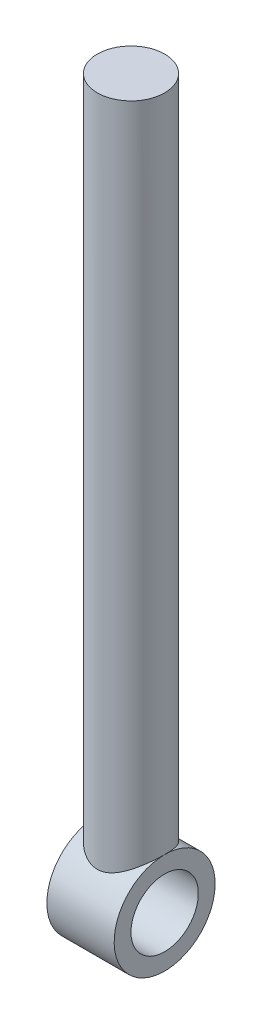
ISO-10303-21;
HEADER;
FILE_DESCRIPTION(('STEP AP214'),'2;1');
FILE_NAME('part.step','',(''),(''),'','','');
FILE_SCHEMA(('AUTOMOTIVE_DESIGN { 1 0 10303 214 1 1 1 1 }'));
ENDSEC;
DATA;
#1=APPLICATION_CONTEXT('core data for automotive mechanical design processes');
#2=APPLICATION_PROTOCOL_DEFINITION('international standard','automotive_design',2000,#1);
#3=PRODUCT_CONTEXT('',#1,'mechanical');
#4=PRODUCT('Part','Part','',(#3));
#5=PRODUCT_RELATED_PRODUCT_CATEGORY('part','',(#4));
#6=PRODUCT_DEFINITION_FORMATION('','',#4);
#7=PRODUCT_DEFINITION_CONTEXT('part definition',#1,'design');
#8=PRODUCT_DEFINITION('design','',#6,#7);
#9=PRODUCT_DEFINITION_SHAPE('','',#8);
#10=(LENGTH_UNIT() NAMED_UNIT(*) SI_UNIT(.MILLI.,.METRE.));
#11=(NAMED_UNIT(*) PLANE_ANGLE_UNIT() SI_UNIT($,.RADIAN.));
#12=(NAMED_UNIT(*) SI_UNIT($,.STERADIAN.) SOLID_ANGLE_UNIT());
#13=UNCERTAINTY_MEASURE_WITH_UNIT(LENGTH_MEASURE(1.E-05),#10,'distance_accuracy_value','');
#14=(GEOMETRIC_REPRESENTATION_CONTEXT(3) GLOBAL_UNCERTAINTY_ASSIGNED_CONTEXT((#13)) GLOBAL_UNIT_ASSIGNED_CONTEXT((#10,
#11,#12)) REPRESENTATION_CONTEXT('',''));
#15=CARTESIAN_POINT('',(0.,0.,0.));
#16=DIRECTION('',(0.,0.,1.));
#17=DIRECTION('',(1.,0.,0.));
#18=AXIS2_PLACEMENT_3D('',#15,#16,#17);
#19=CARTESIAN_POINT('',(-1.37130801687764,5.74894514767932,0.));
#20=DIRECTION('',(0.,1.,0.));
#21=DIRECTION('',(-1.,0.,0.));
#22=AXIS2_PLACEMENT_3D('',#19,#20,#21);
#23=CYLINDRICAL_SURFACE('',#22,5.);
#24=CARTESIAN_POINT('',(-1.37130801687764,5.74894514767932,0.));
#25=DIRECTION('',(0.,1.,0.));
#26=DIRECTION('',(-1.,0.,0.));
#27=AXIS2_PLACEMENT_3D('',#24,#25,#26);
#28=CIRCLE('',#27,5.);
#29=CARTESIAN_POINT('',(-6.37130801687764,5.74894514767932,0.));
#30=VERTEX_POINT('',#29);
#31=EDGE_CURVE('E69',#30,#30,#28,.T.);
#32=ORIENTED_EDGE('',*,*,#31,.F.);
#33=EDGE_LOOP('',(#32));
#34=FACE_BOUND('',#33,.T.);
#35=CARTESIAN_POINT('',(-6.37130801687762,-92.2510548523207,0.));
#36=CARTESIAN_POINT('',(-6.37130798020721,-92.2510548891111,-0.125608018588549));
#37=CARTESIAN_POINT('',(-6.36656847297418,-92.2542170456758,-0.251216670884861));
#38=CARTESIAN_POINT('',(-6.34768521032041,-92.2667859770906,-0.501407130429646));
#39=CARTESIAN_POINT('',(-6.33354140540217,-92.276192784808,-0.625988932270019));
#40=CARTESIAN_POINT('',(-6.2960619018435,-92.3010210289099,-0.873171719994341));
#41=CARTESIAN_POINT('',(-6.27272451883098,-92.3164435674423,-0.99577233861483));
#42=CARTESIAN_POINT('',(-6.21718145931245,-92.3529434855532,-1.23813427215697));
#43=CARTESIAN_POINT('',(-6.18497201330512,-92.374023268645,-1.35789435666897));
#44=CARTESIAN_POINT('',(-6.11229440177363,-92.4212395985673,-1.59314893798379));
#45=CARTESIAN_POINT('',(-6.07186987801649,-92.4473493873714,-1.70866231614512));
#46=CARTESIAN_POINT('',(-5.98312017183493,-92.5041483088217,-1.93546860882205));
#47=CARTESIAN_POINT('',(-5.93479191149438,-92.5348392250674,-2.04675985824915));
#48=CARTESIAN_POINT('',(-5.77869543473773,-92.6328765797119,-2.37341381762447));
#49=CARTESIAN_POINT('',(-5.65975174274378,-92.7062300028856,-2.58175996249981));
#50=CARTESIAN_POINT('',(-5.38465651551374,-92.8703753980374,-2.99324442404475));
#51=CARTESIAN_POINT('',(-5.22620411234585,-92.9621189565025,-3.19444057723902));
#52=CARTESIAN_POINT('',(-4.88196712571065,-93.1515105032619,-3.56933031224002));
#53=CARTESIAN_POINT('',(-4.69614338309014,-93.2491668308463,-3.74298373794807));
#54=CARTESIAN_POINT('',(-4.38332826087215,-93.4018585722215,-3.99366214280298));
#55=CARTESIAN_POINT('',(-4.26447186865215,-93.4575417349533,-4.08060552383283));
#56=CARTESIAN_POINT('',(-4.01882795119402,-93.5666203495112,-4.24410607449973));
#57=CARTESIAN_POINT('',(-3.89203863457096,-93.6200152799966,-4.32066088576892));
#58=CARTESIAN_POINT('',(-3.50059864279213,-93.7738993094209,-4.53366662201286));
#59=CARTESIAN_POINT('',(-3.22424398444033,-93.8684140118837,-4.65396866792279));
#60=CARTESIAN_POINT('',(-2.72945725393351,-94.0016541905317,-4.81686735383668));
#61=CARTESIAN_POINT('',(-2.51733936067432,-94.0486084689332,-4.87187088253824));
#62=CARTESIAN_POINT('',(-2.19256570999672,-94.1018958009874,-4.93332515657475));
#63=CARTESIAN_POINT('',(-2.08324284787392,-94.116798955251,-4.95029943249));
#64=CARTESIAN_POINT('',(-1.86306540125138,-94.1403618859132,-4.97699249744458));
#65=CARTESIAN_POINT('',(-1.75221138139803,-94.1490239043509,-4.98671389202271));
#66=CARTESIAN_POINT('',(-1.52930044238586,-94.15976598836,-4.99875512937179));
#67=CARTESIAN_POINT('',(-1.4172403944567,-94.1618174297408,-5.00104278396599));
#68=CARTESIAN_POINT('',(-1.1933009521821,-94.159172307244,-4.9980849918467));
#69=CARTESIAN_POINT('',(-1.08142155845161,-94.1544757204445,-4.99283951954458));
#70=CARTESIAN_POINT('',(-0.858671925541482,-94.1385286478395,-4.97490634187683));
#71=CARTESIAN_POINT('',(-0.747802275026861,-94.1272745600451,-4.96221454627213));
#72=CARTESIAN_POINT('',(-0.52791145242644,-94.0986743455722,-4.92961024185719));
#73=CARTESIAN_POINT('',(-0.418891049313753,-94.0813257467046,-4.90969480272766));
#74=CARTESIAN_POINT('',(-0.105273451832944,-94.0228740832023,-4.84163703367357));
#75=CARTESIAN_POINT('',(0.0960582759564604,-93.9745178310573,-4.78429713380928));
#76=CARTESIAN_POINT('',(0.486288270956437,-93.8633140974599,-4.64674861534595));
#77=CARTESIAN_POINT('',(0.675182421627787,-93.8004618488652,-4.56653247162609));
#78=CARTESIAN_POINT('',(1.07623728452663,-93.6519521777058,-4.36685173998334));
#79=CARTESIAN_POINT('',(1.28531525809441,-93.5642564944014,-4.2427226470347));
#80=CARTESIAN_POINT('',(1.68217698040954,-93.3837568114999,-3.96670264496564));
#81=CARTESIAN_POINT('',(1.86993399744675,-93.2909466112223,-3.81477749526626));
#82=CARTESIAN_POINT('',(2.15306454112243,-93.1432632151807,-3.54969108213473));
#83=CARTESIAN_POINT('',(2.25582281484516,-93.0877663744956,-3.44464766421748));
#84=CARTESIAN_POINT('',(2.45216912282247,-92.9788843074776,-3.22531791748825));
#85=CARTESIAN_POINT('',(2.54575986295098,-92.9254984608581,-3.11103433427815));
#86=CARTESIAN_POINT('',(2.72307431874827,-92.8222179624971,-2.87366828778323));
#87=CARTESIAN_POINT('',(2.80680278739266,-92.7723216337836,-2.75059010925357));
#88=CARTESIAN_POINT('',(2.96363495953541,-92.6773119661631,-2.49611507932343));
#89=CARTESIAN_POINT('',(3.03674188572223,-92.6321971776147,-2.36472076856898));
#90=CARTESIAN_POINT('',(3.15824202022941,-92.5562622411085,-2.12083178608806));
#91=CARTESIAN_POINT('',(3.20867072642988,-92.5243734003641,-2.00967972723591));
#92=CARTESIAN_POINT('',(3.30160140186619,-92.4651231922291,-1.78295269143192));
#93=CARTESIAN_POINT('',(3.3441049761222,-92.4377609082343,-1.66737861576611));
#94=CARTESIAN_POINT('',(3.42069844295969,-92.3881427248341,-1.43245611415625));
#95=CARTESIAN_POINT('',(3.45479187939217,-92.3658846748934,-1.31310930196113));
#96=CARTESIAN_POINT('',(3.51414065987655,-92.3269652343833,-1.07138735730614));
#97=CARTESIAN_POINT('',(3.53939955758853,-92.3103015935922,-0.94901346373658));
#98=CARTESIAN_POINT('',(3.5808353035399,-92.2828903848878,-0.701493288803479));
#99=CARTESIAN_POINT('',(3.59696998887504,-92.2721702864214,-0.576336870259719));
#100=CARTESIAN_POINT('',(3.61973063924118,-92.2570309375194,-0.324780008160019));
#101=CARTESIAN_POINT('',(3.62635659184743,-92.2526116953169,-0.198379562978767));
#102=CARTESIAN_POINT('',(3.6299939272877,-92.2501869542801,0.0546163050195476));
#103=CARTESIAN_POINT('',(3.62700570639914,-92.2521811910946,0.181211719585377));
#104=CARTESIAN_POINT('',(3.61146408514945,-92.2625313328465,0.433544937832576));
#105=CARTESIAN_POINT('',(3.59891109303296,-92.2708869662658,0.559282777885937));
#106=CARTESIAN_POINT('',(3.56565214068069,-92.2929430443172,0.800084092730034));
#107=CARTESIAN_POINT('',(3.54558401975491,-92.3062247139802,0.91527468950312));
#108=CARTESIAN_POINT('',(3.49761453823097,-92.3378175783783,1.14332502618367));
#109=CARTESIAN_POINT('',(3.46971052465399,-92.3561304764785,1.25618396274927));
#110=CARTESIAN_POINT('',(3.37472468201236,-92.418082858309,1.59016819827963));
#111=CARTESIAN_POINT('',(3.2963411397092,-92.4687549954381,1.80689828647147));
#112=CARTESIAN_POINT('',(3.1070548411055,-92.5886491817926,2.2366977314704));
#113=CARTESIAN_POINT('',(2.99446987417735,-92.6588089453035,2.44875011842612));
#114=CARTESIAN_POINT('',(2.74261048306442,-92.8110076151314,2.85169789706611));
#115=CARTESIAN_POINT('',(2.60331957582681,-92.8930538501615,3.04258010694991));
#116=CARTESIAN_POINT('',(2.2771717405715,-93.0771914663229,3.42963933761378));
#117=CARTESIAN_POINT('',(2.08627617678315,-93.1804010064074,3.62188054324073));
#118=CARTESIAN_POINT('',(1.67591356448858,-93.3867754510299,3.97334834714672));
#119=CARTESIAN_POINT('',(1.45642693765961,-93.4899402759291,4.13255212685989));
#120=CARTESIAN_POINT('',(1.01083590332064,-93.6775628926528,4.40311961015303));
#121=CARTESIAN_POINT('',(0.786861846982872,-93.7628649204662,4.51739093945808));
#122=CARTESIAN_POINT('',(0.319010404402205,-93.9150805018675,4.7124053072464));
#123=CARTESIAN_POINT('',(0.0751697990185893,-93.9820270783993,4.79320869285462));
#124=CARTESIAN_POINT('',(-0.382719367447664,-94.0777246155037,4.90589604497064));
#125=CARTESIAN_POINT('',(-0.59423798896252,-94.1111797885568,4.94396476310194));
#126=CARTESIAN_POINT('',(-1.02274077326541,-94.15406830447,4.99248032394649));
#127=CARTESIAN_POINT('',(-1.23971874035914,-94.1635277386352,5.00295716862677));
#128=CARTESIAN_POINT('',(-1.67291731403349,-94.1569494033126,4.99559738764621));
#129=CARTESIAN_POINT('',(-1.8891373962209,-94.1408965363457,4.97774399693959));
#130=CARTESIAN_POINT('',(-2.31466065405239,-94.085795112616,4.91492740617482));
#131=CARTESIAN_POINT('',(-2.52395420807131,-94.0467158784728,4.8699280383881));
#132=CARTESIAN_POINT('',(-2.98561522996764,-93.93787632773,4.73981418276008));
#133=CARTESIAN_POINT('',(-3.23459995425156,-93.8627153658227,4.64720557432273));
#134=CARTESIAN_POINT('',(-3.59108016959023,-93.7373266307053,4.48217153169634));
#135=CARTESIAN_POINT('',(-3.70718899810467,-93.6933687678807,4.4227291606703));
#136=CARTESIAN_POINT('',(-3.93357139253453,-93.6025204675185,4.29553797555822));
#137=CARTESIAN_POINT('',(-4.0438448497249,-93.5556299753754,4.22778900678102));
#138=CARTESIAN_POINT('',(-4.36943958961037,-93.4106725153253,4.01001251612869));
#139=CARTESIAN_POINT('',(-4.5753730057801,-93.3098624579734,3.84739387541878));
#140=CARTESIAN_POINT('',(-4.86354424735732,-93.1602253668879,3.58070368138862));
#141=CARTESIAN_POINT('',(-4.95618314787854,-93.1105875808576,3.48796686520541));
#142=CARTESIAN_POINT('',(-5.13429002292821,-93.0127701453301,3.29502624182906));
#143=CARTESIAN_POINT('',(-5.21975636102883,-92.9645908301788,3.19482074044038));
#144=CARTESIAN_POINT('',(-5.39478187527062,-92.8639287490985,2.9722858238209));
#145=CARTESIAN_POINT('',(-5.4831564922876,-92.8118261245354,2.84884898400045));
#146=CARTESIAN_POINT('',(-5.64901021006468,-92.7122808465566,2.59315796105782));
#147=CARTESIAN_POINT('',(-5.72649424181249,-92.6648360871277,2.46090780863045));
#148=CARTESIAN_POINT('',(-5.86961080115457,-92.5759879941101,2.18836443414476));
#149=CARTESIAN_POINT('',(-5.93525437258454,-92.5345790377984,2.04807886951546));
#150=CARTESIAN_POINT('',(-6.05376229732177,-92.4590529821897,1.76034275764724));
#151=CARTESIAN_POINT('',(-6.1066311383431,-92.4249333226798,1.61289474847382));
#152=CARTESIAN_POINT('',(-6.1884083450931,-92.3717783741984,1.3455542833391));
#153=CARTESIAN_POINT('',(-6.22003040580739,-92.3510759164964,1.22681585673932));
#154=CARTESIAN_POINT('',(-6.27456237417797,-92.3152307947154,0.986541218916695));
#155=CARTESIAN_POINT('',(-6.29747407241552,-92.3000869879716,0.865005588166448));
#156=CARTESIAN_POINT('',(-6.33425635711462,-92.2757176301385,0.620058880061068));
#157=CARTESIAN_POINT('',(-6.34813231731409,-92.2664885614852,0.496648962158438));
#158=CARTESIAN_POINT('',(-6.36665833838584,-92.254157039453,0.24882626170185));
#159=CARTESIAN_POINT('',(-6.37130805319929,-92.2510548158802,0.12441344170668));
#160=CARTESIAN_POINT('',(-6.37130801687762,-92.2510548523207,0.));
#161=B_SPLINE_CURVE_WITH_KNOTS('',3,(#35,#36,#37,#38,#39,#40,#41,#42,#43,#44,#45,#46,#47,#48,
#49,#50,#51,#52,#53,#54,#55,#56,#57,#58,#59,#60,#61,#62,#63,#64,#65,#66,#67,#68,#69,#70,#71,#72,
#73,#74,#75,#76,#77,#78,#79,#80,#81,#82,#83,#84,#85,#86,#87,#88,#89,#90,#91,#92,#93,#94,#95,#96,
#97,#98,#99,#100,#101,#102,#103,#104,#105,#106,#107,#108,#109,#110,#111,#112,#113,#114,#115,
#116,#117,#118,#119,#120,#121,#122,#123,#124,#125,#126,#127,#128,#129,#130,#131,#132,#133,#134,
#135,#136,#137,#138,#139,#140,#141,#142,#143,#144,#145,#146,#147,#148,#149,#150,#151,#152,#153,
#154,#155,#156,#157,#158,#159,#160),.UNSPECIFIED.,.T.,.F.,(4,2,2,2,2,2,2,2,2,2,2,2,2,2,2,2,2,2,
2,2,2,2,2,2,2,2,2,2,2,2,2,2,2,2,2,2,2,2,2,2,2,2,2,2,2,2,2,2,2,2,2,2,2,2,2,2,2,2,2,2,2,2,4),(0.,
0.376697150092869,0.7533962828654,1.13016446348966,1.5070929703719,1.88206910413629,
2.2571916123895,3.00679232609858,3.82000195441008,4.63438651949459,5.10618372652057,
5.57808786035319,6.5193034140896,7.18876311985436,7.52328813363275,7.85769291407033,
8.19354375486223,8.52939573647987,8.86543237335315,9.20160547846823,9.84356710192614,
10.4857401421745,11.2585349135694,12.032288141549,12.5030398312138,12.9736521532471,
13.44403673454,13.9142782967795,14.2923626335413,14.6703703162267,15.0482184414745,
15.4259144034603,15.8053417246619,16.184769541648,16.5641817195628,16.9435777042718,
17.2962009039366,17.6489436346054,18.3538353932503,19.1014251855315,19.8494778884237,
20.7158209183258,21.5827603441875,22.3763648974055,23.1685321808116,23.8182177151969,
24.4671965231208,25.1165595219072,25.7667896111036,26.5902817323984,27.0029102138176,
27.4155463806554,28.2552096763187,28.6754157798874,29.0957174947647,29.5765774176914,
30.0572189128906,30.5374097593981,31.0174316706402,31.3908313299587,31.7641541882901,
32.1372548206283,32.5103694469936),.UNSPECIFIED.);
#162=CARTESIAN_POINT('',(-6.37130801687764,-92.2510548523207,0.));
#163=VERTEX_POINT('',#162);
#164=CARTESIAN_POINT('',(3.62869198312238,-92.2510548523207,0.));
#165=VERTEX_POINT('',#164);
#166=EDGE_CURVE('E11',#163,#165,#161,.T.);
#167=ORIENTED_EDGE('',*,*,#166,.F.);
#168=EDGE_CURVE('E45',#165,#163,#161,.T.);
#169=ORIENTED_EDGE('',*,*,#168,.F.);
#170=EDGE_LOOP('',(#167,#169));
#171=FACE_BOUND('',#170,.T.);
#172=ADVANCED_FACE('F41',(#34,#171),#23,.T.);
#173=CARTESIAN_POINT('',(-1.37130801687764,5.74894514767932,0.));
#174=DIRECTION('',(0.,-1.,0.));
#175=DIRECTION('',(1.,0.,0.));
#176=AXIS2_PLACEMENT_3D('',#173,#174,#175);
#177=PLANE('',#176);
#178=ORIENTED_EDGE('',*,*,#31,.T.);
#179=EDGE_LOOP('',(#178));
#180=FACE_BOUND('',#179,.T.);
#181=ADVANCED_FACE('F89',(#180),#177,.F.);
#182=CARTESIAN_POINT('',(-6.82580342448713,-99.7510548523207,0.));
#183=DIRECTION('',(-1.,0.,0.));
#184=DIRECTION('',(0.,0.,1.));
#185=AXIS2_PLACEMENT_3D('',#182,#183,#184);
#186=CYLINDRICAL_SURFACE('',#185,7.50000000000001);
#187=CARTESIAN_POINT('',(-6.37130801687764,-99.7510548523207,0.));
#188=DIRECTION('',(-1.,0.,0.));
#189=DIRECTION('',(0.,0.,1.));
#190=AXIS2_PLACEMENT_3D('',#187,#188,#189);
#191=CIRCLE('',#190,7.50000000000001);
#192=EDGE_CURVE('E65',#163,#163,#191,.T.);
#193=ORIENTED_EDGE('',*,*,#192,.F.);
#194=ORIENTED_EDGE('',*,*,#166,.T.);
#195=CARTESIAN_POINT('',(3.62869198312238,-99.7510548523207,0.));
#196=DIRECTION('',(-1.,0.,0.));
#197=DIRECTION('',(0.,0.,1.));
#198=AXIS2_PLACEMENT_3D('',#195,#196,#197);
#199=CIRCLE('',#198,7.50000000000001);
#200=EDGE_CURVE('E67',#165,#165,#199,.T.);
#201=ORIENTED_EDGE('',*,*,#200,.T.);
#202=ORIENTED_EDGE('',*,*,#168,.T.);
#203=EDGE_LOOP('',(#193,#194,#201,#202));
#204=FACE_BOUND('',#203,.T.);
#205=ADVANCED_FACE('F64',(#204),#186,.T.);
#206=CARTESIAN_POINT('',(-6.37130801687764,-92.2510548523207,0.));
#207=DIRECTION('',(1.,0.,0.));
#208=DIRECTION('',(0.,0.,-1.));
#209=AXIS2_PLACEMENT_3D('',#206,#207,#208);
#210=PLANE('',#209);
#211=ORIENTED_EDGE('',*,*,#192,.T.);
#212=EDGE_LOOP('',(#211));
#213=FACE_BOUND('',#212,.T.);
#214=CARTESIAN_POINT('',(-6.37130801687764,-99.7510548523207,0.));
#215=DIRECTION('',(-1.,0.,0.));
#216=DIRECTION('',(0.,0.,1.));
#217=AXIS2_PLACEMENT_3D('',#214,#215,#216);
#218=CIRCLE('',#217,5.);
#219=CARTESIAN_POINT('',(-6.37130801687764,-99.7510548523207,5.));
#220=VERTEX_POINT('',#219);
#221=EDGE_CURVE('E82',#220,#220,#218,.T.);
#222=ORIENTED_EDGE('',*,*,#221,.F.);
#223=EDGE_LOOP('',(#222));
#224=FACE_BOUND('',#223,.T.);
#225=ADVANCED_FACE('F71',(#213,#224),#210,.F.);
#226=CARTESIAN_POINT('',(-6.82580342448713,-99.7510548523207,0.));
#227=DIRECTION('',(-1.,0.,0.));
#228=DIRECTION('',(0.,0.,1.));
#229=AXIS2_PLACEMENT_3D('',#226,#227,#228);
#230=CYLINDRICAL_SURFACE('',#229,5.);
#231=CARTESIAN_POINT('',(3.62869198312238,-99.7510548523207,0.));
#232=DIRECTION('',(-1.,0.,0.));
#233=DIRECTION('',(0.,0.,1.));
#234=AXIS2_PLACEMENT_3D('',#231,#232,#233);
#235=CIRCLE('',#234,5.);
#236=CARTESIAN_POINT('',(3.62869198312238,-99.7510548523207,5.));
#237=VERTEX_POINT('',#236);
#238=EDGE_CURVE('E76',#237,#237,#235,.T.);
#239=ORIENTED_EDGE('',*,*,#238,.F.);
#240=EDGE_LOOP('',(#239));
#241=FACE_BOUND('',#240,.T.);
#242=ORIENTED_EDGE('',*,*,#221,.T.);
#243=EDGE_LOOP('',(#242));
#244=FACE_BOUND('',#243,.T.);
#245=ADVANCED_FACE('F101',(#241,#244),#230,.F.);
#246=CARTESIAN_POINT('',(3.62869198312238,-92.2510548523207,0.));
#247=DIRECTION('',(-1.,0.,0.));
#248=DIRECTION('',(0.,0.,1.));
#249=AXIS2_PLACEMENT_3D('',#246,#247,#248);
#250=PLANE('',#249);
#251=ORIENTED_EDGE('',*,*,#200,.F.);
#252=EDGE_LOOP('',(#251));
#253=FACE_BOUND('',#252,.T.);
#254=ORIENTED_EDGE('',*,*,#238,.T.);
#255=EDGE_LOOP('',(#254));
#256=FACE_BOUND('',#255,.T.);
#257=ADVANCED_FACE('F104',(#253,#256),#250,.F.);
#258=CLOSED_SHELL('',(#172,#181,#205,#225,#245,#257));
#259=MANIFOLD_SOLID_BREP('B2',#258);
#260=ADVANCED_BREP_SHAPE_REPRESENTATION('',(#18,#259),#14);
#261=SHAPE_DEFINITION_REPRESENTATION(#9,#260);
ENDSEC;
END-ISO-10303-21;
